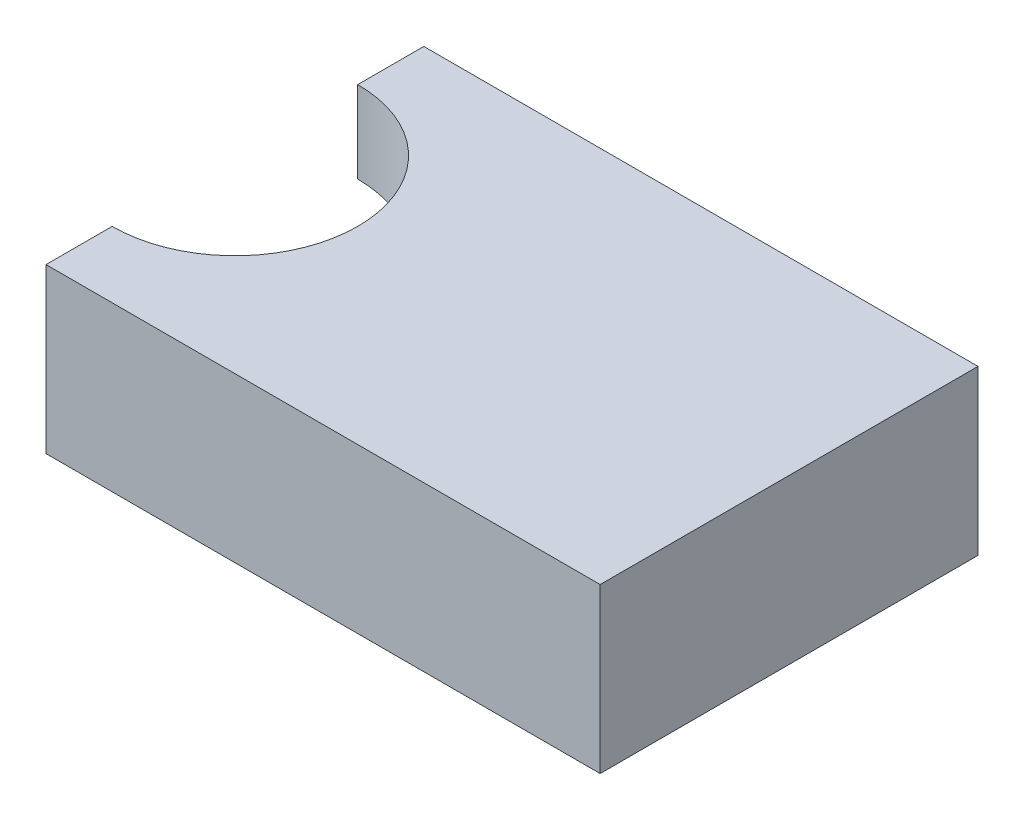
ISO-10303-21;
HEADER;
FILE_DESCRIPTION(('STEP AP214'),'2;1');
FILE_NAME('part.step','',(''),(''),'','','');
FILE_SCHEMA(('AUTOMOTIVE_DESIGN { 1 0 10303 214 1 1 1 1 }'));
ENDSEC;
DATA;
#1=APPLICATION_CONTEXT('core data for automotive mechanical design processes');
#2=APPLICATION_PROTOCOL_DEFINITION('international standard','automotive_design',2000,#1);
#3=PRODUCT_CONTEXT('',#1,'mechanical');
#4=PRODUCT('Part','Part','',(#3));
#5=PRODUCT_RELATED_PRODUCT_CATEGORY('part','',(#4));
#6=PRODUCT_DEFINITION_FORMATION('','',#4);
#7=PRODUCT_DEFINITION_CONTEXT('part definition',#1,'design');
#8=PRODUCT_DEFINITION('design','',#6,#7);
#9=PRODUCT_DEFINITION_SHAPE('','',#8);
#10=(LENGTH_UNIT() NAMED_UNIT(*) SI_UNIT(.MILLI.,.METRE.));
#11=(NAMED_UNIT(*) PLANE_ANGLE_UNIT() SI_UNIT($,.RADIAN.));
#12=(NAMED_UNIT(*) SI_UNIT($,.STERADIAN.) SOLID_ANGLE_UNIT());
#13=UNCERTAINTY_MEASURE_WITH_UNIT(LENGTH_MEASURE(1.E-05),#10,'distance_accuracy_value','');
#14=(GEOMETRIC_REPRESENTATION_CONTEXT(3) GLOBAL_UNCERTAINTY_ASSIGNED_CONTEXT((#13)) GLOBAL_UNIT_ASSIGNED_CONTEXT((#10,
#11,#12)) REPRESENTATION_CONTEXT('',''));
#15=CARTESIAN_POINT('',(0.,0.,0.));
#16=DIRECTION('',(0.,0.,1.));
#17=DIRECTION('',(1.,0.,0.));
#18=AXIS2_PLACEMENT_3D('',#15,#16,#17);
#19=CARTESIAN_POINT('',(-55.,3.25,7.5));
#20=DIRECTION('',(1.,0.,0.));
#21=DIRECTION('',(0.,0.,-1.));
#22=AXIS2_PLACEMENT_3D('',#19,#20,#21);
#23=PLANE('',#22);
#24=DIRECTION('',(0.,0.,-1.));
#25=VECTOR('',#24,1.);
#26=CARTESIAN_POINT('',(-55.,0.,7.5));
#27=LINE('',#26,#25);
#28=CARTESIAN_POINT('',(-55.,0.,-4.875));
#29=VERTEX_POINT('',#28);
#30=CARTESIAN_POINT('',(-55.,0.,-6.55));
#31=VERTEX_POINT('',#30);
#32=EDGE_CURVE('E156',#29,#31,#27,.T.);
#33=ORIENTED_EDGE('',*,*,#32,.F.);
#34=DIRECTION('',(0.,1.,0.));
#35=VECTOR('',#34,1.);
#36=CARTESIAN_POINT('',(-55.,-3.251,-4.875));
#37=LINE('',#36,#35);
#38=CARTESIAN_POINT('',(-55.,3.25,-4.875));
#39=VERTEX_POINT('',#38);
#40=EDGE_CURVE('E56',#29,#39,#37,.T.);
#41=ORIENTED_EDGE('',*,*,#40,.T.);
#42=DIRECTION('',(0.,0.,1.));
#43=VECTOR('',#42,1.);
#44=CARTESIAN_POINT('',(-55.,3.25,7.5));
#45=LINE('',#44,#43);
#46=CARTESIAN_POINT('',(-55.,3.25,-7.5));
#47=VERTEX_POINT('',#46);
#48=EDGE_CURVE('E221',#47,#39,#45,.T.);
#49=ORIENTED_EDGE('',*,*,#48,.F.);
#50=DIRECTION('',(0.,-1.,0.));
#51=VECTOR('',#50,1.);
#52=CARTESIAN_POINT('',(-55.,3.25,-7.5));
#53=LINE('',#52,#51);
#54=CARTESIAN_POINT('',(-55.,-3.25,-7.5));
#55=VERTEX_POINT('',#54);
#56=EDGE_CURVE('E154',#47,#55,#53,.T.);
#57=ORIENTED_EDGE('',*,*,#56,.T.);
#58=DIRECTION('',(0.,0.,1.));
#59=VECTOR('',#58,1.);
#60=CARTESIAN_POINT('',(-55.,-3.25,7.5));
#61=LINE('',#60,#59);
#62=CARTESIAN_POINT('',(-55.,-3.25,7.5));
#63=VERTEX_POINT('',#62);
#64=EDGE_CURVE('E139',#55,#63,#61,.T.);
#65=ORIENTED_EDGE('',*,*,#64,.T.);
#66=DIRECTION('',(0.,-1.,0.));
#67=VECTOR('',#66,1.);
#68=CARTESIAN_POINT('',(-55.,3.25,7.5));
#69=LINE('',#68,#67);
#70=CARTESIAN_POINT('',(-55.,3.25,7.5));
#71=VERTEX_POINT('',#70);
#72=EDGE_CURVE('E151',#71,#63,#69,.T.);
#73=ORIENTED_EDGE('',*,*,#72,.F.);
#74=CARTESIAN_POINT('',(-55.,3.25,4.875));
#75=VERTEX_POINT('',#74);
#76=EDGE_CURVE('E220',#75,#71,#45,.T.);
#77=ORIENTED_EDGE('',*,*,#76,.F.);
#78=DIRECTION('',(0.,1.,0.));
#79=VECTOR('',#78,1.);
#80=CARTESIAN_POINT('',(-55.,-3.251,4.875));
#81=LINE('',#80,#79);
#82=CARTESIAN_POINT('',(-55.,0.,4.875));
#83=VERTEX_POINT('',#82);
#84=EDGE_CURVE('E185',#83,#75,#81,.T.);
#85=ORIENTED_EDGE('',*,*,#84,.F.);
#86=CARTESIAN_POINT('',(-55.,0.,6.55));
#87=VERTEX_POINT('',#86);
#88=EDGE_CURVE('E158',#87,#83,#27,.T.);
#89=ORIENTED_EDGE('',*,*,#88,.F.);
#90=DIRECTION('',(0.,1.,0.));
#91=VECTOR('',#90,1.);
#92=CARTESIAN_POINT('',(-55.,-2.7,6.55));
#93=LINE('',#92,#91);
#94=CARTESIAN_POINT('',(-55.,-2.7,6.55));
#95=VERTEX_POINT('',#94);
#96=EDGE_CURVE('E11',#87,#95,#93,.F.);
#97=ORIENTED_EDGE('',*,*,#96,.T.);
#98=DIRECTION('',(0.,0.,1.));
#99=VECTOR('',#98,1.);
#100=CARTESIAN_POINT('',(-55.,-2.7,7.5));
#101=LINE('',#100,#99);
#102=CARTESIAN_POINT('',(-55.,-2.7,-6.55));
#103=VERTEX_POINT('',#102);
#104=EDGE_CURVE('E41',#103,#95,#101,.T.);
#105=ORIENTED_EDGE('',*,*,#104,.F.);
#106=DIRECTION('',(0.,1.,0.));
#107=VECTOR('',#106,1.);
#108=CARTESIAN_POINT('',(-55.,-2.7,-6.55));
#109=LINE('',#108,#107);
#110=EDGE_CURVE('E159',#103,#31,#109,.T.);
#111=ORIENTED_EDGE('',*,*,#110,.T.);
#112=EDGE_LOOP('',(#33,#41,#49,#57,#65,#73,#77,#85,#89,#97,#105,#111));
#113=FACE_BOUND('',#112,.T.);
#114=ADVANCED_FACE('F33',(#113),#23,.F.);
#115=CARTESIAN_POINT('',(-55.,3.25,-7.5));
#116=DIRECTION('',(0.,0.,1.));
#117=DIRECTION('',(1.,0.,0.));
#118=AXIS2_PLACEMENT_3D('',#115,#116,#117);
#119=PLANE('',#118);
#120=DIRECTION('',(-1.,0.,0.));
#121=VECTOR('',#120,1.);
#122=CARTESIAN_POINT('',(-55.,3.25,-7.5));
#123=LINE('',#122,#121);
#124=CARTESIAN_POINT('',(-33.,3.25,-7.49999999999999));
#125=VERTEX_POINT('',#124);
#126=EDGE_CURVE('E135',#125,#47,#123,.T.);
#127=ORIENTED_EDGE('',*,*,#126,.F.);
#128=DIRECTION('',(0.,1.,0.));
#129=VECTOR('',#128,1.);
#130=CARTESIAN_POINT('',(-33.,-3.25,-7.49999999999999));
#131=LINE('',#130,#129);
#132=CARTESIAN_POINT('',(-33.,-3.25,-7.49999999999999));
#133=VERTEX_POINT('',#132);
#134=EDGE_CURVE('E122',#133,#125,#131,.T.);
#135=ORIENTED_EDGE('',*,*,#134,.F.);
#136=DIRECTION('',(-1.,0.,0.));
#137=VECTOR('',#136,1.);
#138=CARTESIAN_POINT('',(-55.,-3.25,-7.5));
#139=LINE('',#138,#137);
#140=EDGE_CURVE('E133',#133,#55,#139,.T.);
#141=ORIENTED_EDGE('',*,*,#140,.T.);
#142=ORIENTED_EDGE('',*,*,#56,.F.);
#143=EDGE_LOOP('',(#127,#135,#141,#142));
#144=FACE_BOUND('',#143,.T.);
#145=ADVANCED_FACE('F35',(#144),#119,.F.);
#146=CARTESIAN_POINT('',(-55.,3.25,7.5));
#147=DIRECTION('',(0.,0.,-1.));
#148=DIRECTION('',(-1.,0.,0.));
#149=AXIS2_PLACEMENT_3D('',#146,#147,#148);
#150=PLANE('',#149);
#151=DIRECTION('',(1.,0.,0.));
#152=VECTOR('',#151,1.);
#153=CARTESIAN_POINT('',(-55.,-3.25,7.5));
#154=LINE('',#153,#152);
#155=CARTESIAN_POINT('',(-33.,-3.25,7.5));
#156=VERTEX_POINT('',#155);
#157=EDGE_CURVE('E142',#63,#156,#154,.T.);
#158=ORIENTED_EDGE('',*,*,#157,.T.);
#159=DIRECTION('',(0.,1.,0.));
#160=VECTOR('',#159,1.);
#161=CARTESIAN_POINT('',(-33.,-3.25,7.5));
#162=LINE('',#161,#160);
#163=CARTESIAN_POINT('',(-33.,3.25,7.5));
#164=VERTEX_POINT('',#163);
#165=EDGE_CURVE('E48',#156,#164,#162,.T.);
#166=ORIENTED_EDGE('',*,*,#165,.T.);
#167=DIRECTION('',(1.,0.,0.));
#168=VECTOR('',#167,1.);
#169=CARTESIAN_POINT('',(-55.,3.25,7.5));
#170=LINE('',#169,#168);
#171=EDGE_CURVE('E147',#71,#164,#170,.T.);
#172=ORIENTED_EDGE('',*,*,#171,.F.);
#173=ORIENTED_EDGE('',*,*,#72,.T.);
#174=EDGE_LOOP('',(#158,#166,#172,#173));
#175=FACE_BOUND('',#174,.T.);
#176=ADVANCED_FACE('F231',(#175),#150,.F.);
#177=CARTESIAN_POINT('',(0.,3.25,0.));
#178=DIRECTION('',(0.,-1.,0.));
#179=DIRECTION('',(0.,0.,-1.));
#180=AXIS2_PLACEMENT_3D('',#177,#178,#179);
#181=PLANE('',#180);
#182=ORIENTED_EDGE('',*,*,#171,.T.);
#183=DIRECTION('',(0.,0.,1.));
#184=VECTOR('',#183,1.);
#185=CARTESIAN_POINT('',(-33.,3.25,-7.49999999999999));
#186=LINE('',#185,#184);
#187=EDGE_CURVE('E128',#125,#164,#186,.T.);
#188=ORIENTED_EDGE('',*,*,#187,.F.);
#189=ORIENTED_EDGE('',*,*,#126,.T.);
#190=ORIENTED_EDGE('',*,*,#48,.T.);
#191=CARTESIAN_POINT('',(-55.,3.25,0.));
#192=DIRECTION('',(0.,1.,0.));
#193=DIRECTION('',(0.,0.,1.));
#194=AXIS2_PLACEMENT_3D('',#191,#192,#193);
#195=CIRCLE('',#194,4.875);
#196=EDGE_CURVE('E198',#75,#39,#195,.T.);
#197=ORIENTED_EDGE('',*,*,#196,.F.);
#198=ORIENTED_EDGE('',*,*,#76,.T.);
#199=EDGE_LOOP('',(#182,#188,#189,#190,#197,#198));
#200=FACE_BOUND('',#199,.T.);
#201=ADVANCED_FACE('F228',(#200),#181,.F.);
#202=CARTESIAN_POINT('',(0.,-3.25,0.));
#203=DIRECTION('',(0.,-1.,0.));
#204=DIRECTION('',(0.,0.,-1.));
#205=AXIS2_PLACEMENT_3D('',#202,#203,#204);
#206=PLANE('',#205);
#207=DIRECTION('',(0.,0.,1.));
#208=VECTOR('',#207,1.);
#209=CARTESIAN_POINT('',(-33.,-3.25,-7.49999999999999));
#210=LINE('',#209,#208);
#211=EDGE_CURVE('E119',#133,#156,#210,.T.);
#212=ORIENTED_EDGE('',*,*,#211,.T.);
#213=ORIENTED_EDGE('',*,*,#157,.F.);
#214=ORIENTED_EDGE('',*,*,#64,.F.);
#215=ORIENTED_EDGE('',*,*,#140,.F.);
#216=EDGE_LOOP('',(#212,#213,#214,#215));
#217=FACE_BOUND('',#216,.T.);
#218=ADVANCED_FACE('F138',(#217),#206,.T.);
#219=CARTESIAN_POINT('',(-55.,0.,0.));
#220=DIRECTION('',(0.,-1.,0.));
#221=DIRECTION('',(-1.,0.,0.));
#222=AXIS2_PLACEMENT_3D('',#219,#220,#221);
#223=PLANE('',#222);
#224=CARTESIAN_POINT('',(-55.,0.,0.));
#225=DIRECTION('',(0.,-1.,0.));
#226=DIRECTION('',(0.,0.,-1.));
#227=AXIS2_PLACEMENT_3D('',#224,#225,#226);
#228=CIRCLE('',#227,4.875);
#229=EDGE_CURVE('E188',#83,#29,#228,.F.);
#230=ORIENTED_EDGE('',*,*,#229,.T.);
#231=ORIENTED_EDGE('',*,*,#32,.T.);
#232=CARTESIAN_POINT('',(-55.,0.,0.));
#233=DIRECTION('',(0.,-1.,0.));
#234=DIRECTION('',(0.,0.,-1.));
#235=AXIS2_PLACEMENT_3D('',#232,#233,#234);
#236=CIRCLE('',#235,6.55);
#237=CARTESIAN_POINT('',(-50.7391540334511,0.,-4.97470518215341));
#238=VERTEX_POINT('',#237);
#239=EDGE_CURVE('E194',#31,#238,#236,.T.);
#240=ORIENTED_EDGE('',*,*,#239,.T.);
#241=DIRECTION('',(0.990535760024713,0.,0.137254901960784));
#242=VECTOR('',#241,1.);
#243=CARTESIAN_POINT('',(-38.2582191595853,0.,-3.24526788001236));
#244=LINE('',#243,#242);
#245=CARTESIAN_POINT('',(-38.2582191595853,0.,-3.24526788001236));
#246=VERTEX_POINT('',#245);
#247=EDGE_CURVE('E196',#238,#246,#244,.T.);
#248=ORIENTED_EDGE('',*,*,#247,.T.);
#249=CARTESIAN_POINT('',(-38.707904009627,0.,0.));
#250=DIRECTION('',(0.,-1.,0.));
#251=DIRECTION('',(0.,0.,-1.));
#252=AXIS2_PLACEMENT_3D('',#249,#250,#251);
#253=CIRCLE('',#252,3.27627533601754);
#254=CARTESIAN_POINT('',(-38.2582191595853,0.,3.24526788001236));
#255=VERTEX_POINT('',#254);
#256=EDGE_CURVE('E205',#246,#255,#253,.T.);
#257=ORIENTED_EDGE('',*,*,#256,.T.);
#258=DIRECTION('',(-0.990535760024713,0.,0.137254901960784));
#259=VECTOR('',#258,1.);
#260=CARTESIAN_POINT('',(-50.7391540334511,0.,4.97470518215341));
#261=LINE('',#260,#259);
#262=CARTESIAN_POINT('',(-50.7391540334511,0.,4.97470518215341));
#263=VERTEX_POINT('',#262);
#264=EDGE_CURVE('E193',#255,#263,#261,.T.);
#265=ORIENTED_EDGE('',*,*,#264,.T.);
#266=CARTESIAN_POINT('',(-55.,0.,0.));
#267=DIRECTION('',(0.,-1.,0.));
#268=DIRECTION('',(0.,0.,-1.));
#269=AXIS2_PLACEMENT_3D('',#266,#267,#268);
#270=CIRCLE('',#269,6.55);
#271=EDGE_CURVE('E190',#263,#87,#270,.T.);
#272=ORIENTED_EDGE('',*,*,#271,.T.);
#273=ORIENTED_EDGE('',*,*,#88,.T.);
#274=EDGE_LOOP('',(#230,#231,#240,#248,#257,#265,#272,#273));
#275=FACE_BOUND('',#274,.T.);
#276=ADVANCED_FACE('F187',(#275),#223,.T.);
#277=CARTESIAN_POINT('',(-55.,-2.7,0.));
#278=DIRECTION('',(0.,1.,0.));
#279=DIRECTION('',(0.,0.,1.));
#280=AXIS2_PLACEMENT_3D('',#277,#278,#279);
#281=CYLINDRICAL_SURFACE('',#280,6.55);
#282=ORIENTED_EDGE('',*,*,#271,.F.);
#283=DIRECTION('',(0.,1.,0.));
#284=VECTOR('',#283,1.);
#285=CARTESIAN_POINT('',(-50.7391540334511,-2.7,4.97470518215341));
#286=LINE('',#285,#284);
#287=CARTESIAN_POINT('',(-50.7391540334511,-2.7,4.97470518215341));
#288=VERTEX_POINT('',#287);
#289=EDGE_CURVE('E144',#288,#263,#286,.T.);
#290=ORIENTED_EDGE('',*,*,#289,.F.);
#291=CARTESIAN_POINT('',(-55.,-2.7,0.));
#292=DIRECTION('',(0.,1.,0.));
#293=DIRECTION('',(0.,0.,1.));
#294=AXIS2_PLACEMENT_3D('',#291,#292,#293);
#295=CIRCLE('',#294,6.55);
#296=EDGE_CURVE('E167',#95,#288,#295,.T.);
#297=ORIENTED_EDGE('',*,*,#296,.F.);
#298=ORIENTED_EDGE('',*,*,#96,.F.);
#299=EDGE_LOOP('',(#282,#290,#297,#298));
#300=FACE_BOUND('',#299,.T.);
#301=ADVANCED_FACE('F176',(#300),#281,.F.);
#302=CARTESIAN_POINT('',(-55.,-2.7,0.));
#303=DIRECTION('',(0.,1.,0.));
#304=DIRECTION('',(0.,0.,1.));
#305=AXIS2_PLACEMENT_3D('',#302,#303,#304);
#306=CYLINDRICAL_SURFACE('',#305,6.55);
#307=CARTESIAN_POINT('',(-55.,-2.7,0.));
#308=DIRECTION('',(0.,1.,0.));
#309=DIRECTION('',(0.,0.,1.));
#310=AXIS2_PLACEMENT_3D('',#307,#308,#309);
#311=CIRCLE('',#310,6.55);
#312=CARTESIAN_POINT('',(-50.7391540334511,-2.7,-4.97470518215341));
#313=VERTEX_POINT('',#312);
#314=EDGE_CURVE('E171',#313,#103,#311,.T.);
#315=ORIENTED_EDGE('',*,*,#314,.F.);
#316=DIRECTION('',(0.,1.,0.));
#317=VECTOR('',#316,1.);
#318=CARTESIAN_POINT('',(-50.7391540334511,-2.7,-4.97470518215341));
#319=LINE('',#318,#317);
#320=EDGE_CURVE('E216',#313,#238,#319,.T.);
#321=ORIENTED_EDGE('',*,*,#320,.T.);
#322=ORIENTED_EDGE('',*,*,#239,.F.);
#323=ORIENTED_EDGE('',*,*,#110,.F.);
#324=EDGE_LOOP('',(#315,#321,#322,#323));
#325=FACE_BOUND('',#324,.T.);
#326=ADVANCED_FACE('F238',(#325),#306,.F.);
#327=CARTESIAN_POINT('',(-38.707904009627,-2.7,0.));
#328=DIRECTION('',(0.,1.,0.));
#329=DIRECTION('',(0.,0.,1.));
#330=AXIS2_PLACEMENT_3D('',#327,#328,#329);
#331=PLANE('',#330);
#332=ORIENTED_EDGE('',*,*,#104,.T.);
#333=ORIENTED_EDGE('',*,*,#296,.T.);
#334=DIRECTION('',(0.990535760024713,0.,-0.137254901960784));
#335=VECTOR('',#334,1.);
#336=CARTESIAN_POINT('',(-50.7391540334511,-2.7,4.97470518215341));
#337=LINE('',#336,#335);
#338=CARTESIAN_POINT('',(-38.2582191595853,-2.7,3.24526788001236));
#339=VERTEX_POINT('',#338);
#340=EDGE_CURVE('E179',#288,#339,#337,.T.);
#341=ORIENTED_EDGE('',*,*,#340,.T.);
#342=CARTESIAN_POINT('',(-38.707904009627,-2.7,0.));
#343=DIRECTION('',(0.,1.,0.));
#344=DIRECTION('',(0.,0.,1.));
#345=AXIS2_PLACEMENT_3D('',#342,#343,#344);
#346=CIRCLE('',#345,3.27627533601754);
#347=CARTESIAN_POINT('',(-38.2582191595853,-2.7,-3.24526788001236));
#348=VERTEX_POINT('',#347);
#349=EDGE_CURVE('E206',#339,#348,#346,.T.);
#350=ORIENTED_EDGE('',*,*,#349,.T.);
#351=DIRECTION('',(-0.990535760024713,0.,-0.137254901960784));
#352=VECTOR('',#351,1.);
#353=CARTESIAN_POINT('',(-38.2582191595853,-2.7,-3.24526788001236));
#354=LINE('',#353,#352);
#355=EDGE_CURVE('E210',#348,#313,#354,.T.);
#356=ORIENTED_EDGE('',*,*,#355,.T.);
#357=ORIENTED_EDGE('',*,*,#314,.T.);
#358=EDGE_LOOP('',(#332,#333,#341,#350,#356,#357));
#359=FACE_BOUND('',#358,.T.);
#360=ADVANCED_FACE('F165',(#359),#331,.T.);
#361=CARTESIAN_POINT('',(-38.707904009627,-2.7,0.));
#362=DIRECTION('',(0.,1.,0.));
#363=DIRECTION('',(0.,0.,1.));
#364=AXIS2_PLACEMENT_3D('',#361,#362,#363);
#365=CYLINDRICAL_SURFACE('',#364,3.27627533601754);
#366=DIRECTION('',(0.,1.,0.));
#367=VECTOR('',#366,1.);
#368=CARTESIAN_POINT('',(-38.2582191595853,-2.7,-3.24526788001236));
#369=LINE('',#368,#367);
#370=EDGE_CURVE('E213',#348,#246,#369,.T.);
#371=ORIENTED_EDGE('',*,*,#370,.F.);
#372=ORIENTED_EDGE('',*,*,#349,.F.);
#373=DIRECTION('',(0.,1.,0.));
#374=VECTOR('',#373,1.);
#375=CARTESIAN_POINT('',(-38.2582191595853,-2.7,3.24526788001236));
#376=LINE('',#375,#374);
#377=EDGE_CURVE('E140',#339,#255,#376,.T.);
#378=ORIENTED_EDGE('',*,*,#377,.T.);
#379=ORIENTED_EDGE('',*,*,#256,.F.);
#380=EDGE_LOOP('',(#371,#372,#378,#379));
#381=FACE_BOUND('',#380,.T.);
#382=ADVANCED_FACE('F245',(#381),#365,.F.);
#383=CARTESIAN_POINT('',(-50.7391540334511,-2.7,4.97470518215341));
#384=DIRECTION('',(0.137254901960784,0.,0.990535760024713));
#385=DIRECTION('',(0.990535760024713,0.,-0.137254901960784));
#386=AXIS2_PLACEMENT_3D('',#383,#384,#385);
#387=PLANE('',#386);
#388=ORIENTED_EDGE('',*,*,#377,.F.);
#389=ORIENTED_EDGE('',*,*,#340,.F.);
#390=ORIENTED_EDGE('',*,*,#289,.T.);
#391=ORIENTED_EDGE('',*,*,#264,.F.);
#392=EDGE_LOOP('',(#388,#389,#390,#391));
#393=FACE_BOUND('',#392,.T.);
#394=ADVANCED_FACE('F248',(#393),#387,.F.);
#395=CARTESIAN_POINT('',(-38.2582191595853,-2.7,-3.24526788001236));
#396=DIRECTION('',(0.137254901960784,0.,-0.990535760024713));
#397=DIRECTION('',(-0.990535760024713,0.,-0.137254901960784));
#398=AXIS2_PLACEMENT_3D('',#395,#396,#397);
#399=PLANE('',#398);
#400=ORIENTED_EDGE('',*,*,#320,.F.);
#401=ORIENTED_EDGE('',*,*,#355,.F.);
#402=ORIENTED_EDGE('',*,*,#370,.T.);
#403=ORIENTED_EDGE('',*,*,#247,.F.);
#404=EDGE_LOOP('',(#400,#401,#402,#403));
#405=FACE_BOUND('',#404,.T.);
#406=ADVANCED_FACE('F242',(#405),#399,.F.);
#407=CARTESIAN_POINT('',(-55.,-3.251,0.));
#408=DIRECTION('',(0.,1.,0.));
#409=DIRECTION('',(0.,0.,1.));
#410=AXIS2_PLACEMENT_3D('',#407,#408,#409);
#411=CYLINDRICAL_SURFACE('',#410,4.875);
#412=ORIENTED_EDGE('',*,*,#84,.T.);
#413=ORIENTED_EDGE('',*,*,#196,.T.);
#414=ORIENTED_EDGE('',*,*,#40,.F.);
#415=ORIENTED_EDGE('',*,*,#229,.F.);
#416=EDGE_LOOP('',(#412,#413,#414,#415));
#417=FACE_BOUND('',#416,.T.);
#418=ADVANCED_FACE('F255',(#417),#411,.F.);
#419=CARTESIAN_POINT('',(-33.,-3.25,-7.49999999999999));
#420=DIRECTION('',(-1.,0.,0.));
#421=DIRECTION('',(0.,0.,1.));
#422=AXIS2_PLACEMENT_3D('',#419,#420,#421);
#423=PLANE('',#422);
#424=ORIENTED_EDGE('',*,*,#187,.T.);
#425=ORIENTED_EDGE('',*,*,#165,.F.);
#426=ORIENTED_EDGE('',*,*,#211,.F.);
#427=ORIENTED_EDGE('',*,*,#134,.T.);
#428=EDGE_LOOP('',(#424,#425,#426,#427));
#429=FACE_BOUND('',#428,.T.);
#430=ADVANCED_FACE('F121',(#429),#423,.F.);
#431=CLOSED_SHELL('',(#114,#145,#176,#201,#218,#276,#301,#326,#360,#382,#394,#406,#418,#430));
#432=MANIFOLD_SOLID_BREP('B2',#431);
#433=ADVANCED_BREP_SHAPE_REPRESENTATION('',(#18,#432),#14);
#434=SHAPE_DEFINITION_REPRESENTATION(#9,#433);
ENDSEC;
END-ISO-10303-21;
